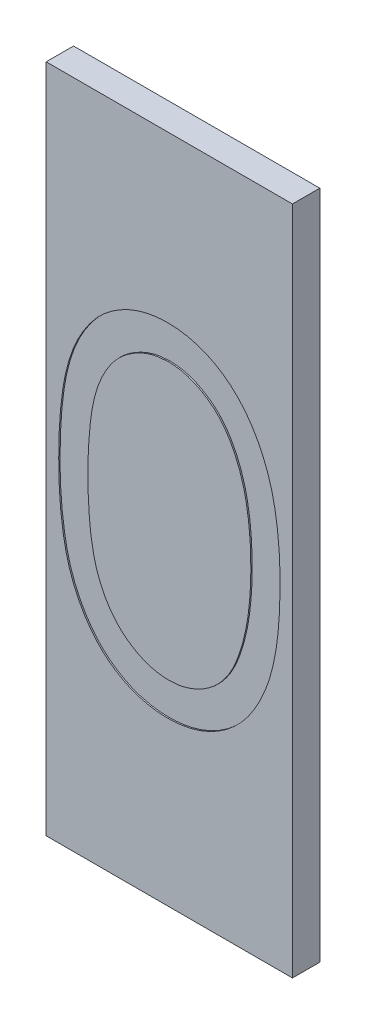
ISO-10303-21;
HEADER;
FILE_DESCRIPTION(('STEP AP214'),'2;1');
FILE_NAME('part.step','',(''),(''),'','','');
FILE_SCHEMA(('AUTOMOTIVE_DESIGN { 1 0 10303 214 1 1 1 1 }'));
ENDSEC;
DATA;
#1=APPLICATION_CONTEXT('core data for automotive mechanical design processes');
#2=APPLICATION_PROTOCOL_DEFINITION('international standard','automotive_design',2000,#1);
#3=PRODUCT_CONTEXT('',#1,'mechanical');
#4=PRODUCT('Part','Part','',(#3));
#5=PRODUCT_RELATED_PRODUCT_CATEGORY('part','',(#4));
#6=PRODUCT_DEFINITION_FORMATION('','',#4);
#7=PRODUCT_DEFINITION_CONTEXT('part definition',#1,'design');
#8=PRODUCT_DEFINITION('design','',#6,#7);
#9=PRODUCT_DEFINITION_SHAPE('','',#8);
#10=(LENGTH_UNIT() NAMED_UNIT(*) SI_UNIT(.MILLI.,.METRE.));
#11=(NAMED_UNIT(*) PLANE_ANGLE_UNIT() SI_UNIT($,.RADIAN.));
#12=(NAMED_UNIT(*) SI_UNIT($,.STERADIAN.) SOLID_ANGLE_UNIT());
#13=UNCERTAINTY_MEASURE_WITH_UNIT(LENGTH_MEASURE(1.E-05),#10,'distance_accuracy_value','');
#14=(GEOMETRIC_REPRESENTATION_CONTEXT(3) GLOBAL_UNCERTAINTY_ASSIGNED_CONTEXT((#13)) GLOBAL_UNIT_ASSIGNED_CONTEXT((#10,
#11,#12)) REPRESENTATION_CONTEXT('',''));
#15=CARTESIAN_POINT('',(0.,0.,0.));
#16=DIRECTION('',(0.,0.,1.));
#17=DIRECTION('',(1.,0.,0.));
#18=AXIS2_PLACEMENT_3D('',#15,#16,#17);
#19=CARTESIAN_POINT('',(0.,0.,2.));
#20=DIRECTION('',(0.,0.,1.));
#21=DIRECTION('',(1.,0.,0.));
#22=AXIS2_PLACEMENT_3D('',#19,#20,#21);
#23=PLANE('',#22);
#24=DIRECTION('',(0.,-1.,0.));
#25=VECTOR('',#24,1.);
#26=CARTESIAN_POINT('',(0.,0.,2.));
#27=LINE('',#26,#25);
#28=CARTESIAN_POINT('',(0.,49.,2.));
#29=VERTEX_POINT('',#28);
#30=CARTESIAN_POINT('',(0.,0.,2.));
#31=VERTEX_POINT('',#30);
#32=EDGE_CURVE('E240',#29,#31,#27,.T.);
#33=ORIENTED_EDGE('',*,*,#32,.T.);
#34=DIRECTION('',(1.,0.,0.));
#35=VECTOR('',#34,1.);
#36=CARTESIAN_POINT('',(18.,0.,2.));
#37=LINE('',#36,#35);
#38=CARTESIAN_POINT('',(18.,0.,2.));
#39=VERTEX_POINT('',#38);
#40=EDGE_CURVE('E243',#31,#39,#37,.T.);
#41=ORIENTED_EDGE('',*,*,#40,.T.);
#42=DIRECTION('',(0.,1.,0.));
#43=VECTOR('',#42,1.);
#44=CARTESIAN_POINT('',(18.,0.,2.));
#45=LINE('',#44,#43);
#46=CARTESIAN_POINT('',(18.,49.,2.));
#47=VERTEX_POINT('',#46);
#48=EDGE_CURVE('E246',#39,#47,#45,.T.);
#49=ORIENTED_EDGE('',*,*,#48,.T.);
#50=DIRECTION('',(-1.,0.,0.));
#51=VECTOR('',#50,1.);
#52=CARTESIAN_POINT('',(18.,49.,2.));
#53=LINE('',#52,#51);
#54=EDGE_CURVE('E248',#47,#29,#53,.T.);
#55=ORIENTED_EDGE('',*,*,#54,.T.);
#56=EDGE_LOOP('',(#33,#41,#49,#55));
#57=FACE_BOUND('',#56,.T.);
#58=CARTESIAN_POINT('',(17.0961538461538,24.3967097355769,2.));
#59=CARTESIAN_POINT('',(17.0917207441675,24.0325560047647,2.));
#60=CARTESIAN_POINT('',(17.0830830257339,23.323017310868,2.));
#61=CARTESIAN_POINT('',(17.0383243243322,22.2852619252102,2.));
#62=CARTESIAN_POINT('',(16.9501593514912,21.3055609520539,2.));
#63=CARTESIAN_POINT('',(16.8398735381761,20.3815647699687,2.));
#64=CARTESIAN_POINT('',(16.6871268079462,19.5171191846945,2.));
#65=CARTESIAN_POINT('',(16.499313087558,18.7092328477967,2.));
#66=CARTESIAN_POINT('',(16.2907814269314,17.9544169316444,2.));
#67=CARTESIAN_POINT('',(16.03336970272,17.2588550883696,2.));
#68=CARTESIAN_POINT('',(15.7516289769647,16.612844259593,2.));
#69=CARTESIAN_POINT('',(15.4450927315572,16.0095909825642,2.));
#70=CARTESIAN_POINT('',(15.1166855219386,15.4437631698688,2.));
#71=CARTESIAN_POINT('',(14.7588942389716,14.9198898916407,2.));
#72=CARTESIAN_POINT('',(14.3775308384745,14.43426009977,2.));
#73=CARTESIAN_POINT('',(13.9644330254364,13.9954459170872,2.));
#74=CARTESIAN_POINT('',(13.5312456517962,13.5928740239094,2.));
#75=CARTESIAN_POINT('',(13.0726004654973,13.2346549156401,2.));
#76=CARTESIAN_POINT('',(12.5935504472928,12.9211136555248,2.));
#77=CARTESIAN_POINT('',(12.1039717275003,12.6407122805649,2.));
#78=CARTESIAN_POINT('',(11.5951776372268,12.4146112660293,2.));
#79=CARTESIAN_POINT('',(11.0786984409778,12.2204710765199,2.));
#80=CARTESIAN_POINT('',(10.5471465215172,12.0721501449374,2.));
#81=CARTESIAN_POINT('',(10.0011844705765,11.969594092199,2.));
#82=CARTESIAN_POINT('',(9.44358936541881,11.8976677661049,2.));
#83=CARTESIAN_POINT('',(9.06666086013384,11.8921808226676,2.));
#84=CARTESIAN_POINT('',(8.87721604567308,11.8894230769231,2.));
#85=B_SPLINE_CURVE_WITH_KNOTS('',3,(#58,#59,#60,#61,#62,#63,#64,#65,#66,#67,#68,#69,#70,#71,#72,
#73,#74,#75,#76,#77,#78,#79,#80,#81,#82,#83,#84),.UNSPECIFIED.,.F.,.F.,(4,1,1,1,1,1,1,1,1,1,1,1,
1,1,1,1,1,1,1,1,1,1,1,1,4),(0.,0.0650632896172793,0.126773166466523,0.185515763226079,
0.240764679167715,0.292979796023598,0.342250372779767,0.38891928618566,0.43277566405831,
0.474628432631117,0.514774690637953,0.553605893498442,0.591426406431173,0.628028119946067,
0.66380363411032,0.698984336131664,0.733591489306705,0.767628469151139,0.801208347786592,
0.834263839726623,0.866980694728776,0.89971974151816,0.932701912498538,0.96617588343275,1.),.UNSPECIFIED.);
#86=CARTESIAN_POINT('',(17.0961538461538,24.3967097355769,2.));
#87=VERTEX_POINT('',#86);
#88=CARTESIAN_POINT('',(8.87721604567308,11.8894230769231,2.));
#89=VERTEX_POINT('',#88);
#90=EDGE_CURVE('E220',#87,#89,#85,.T.);
#91=ORIENTED_EDGE('',*,*,#90,.T.);
#92=CARTESIAN_POINT('',(8.87721604567308,11.8894230769231,2.));
#93=CARTESIAN_POINT('',(8.68940948445197,11.8925959595982,2.));
#94=CARTESIAN_POINT('',(8.31909160345805,11.8988522649224,2.));
#95=CARTESIAN_POINT('',(7.77036706609321,11.9635796166545,2.));
#96=CARTESIAN_POINT('',(7.23776687054643,12.0676436652957,2.));
#97=CARTESIAN_POINT('',(6.71866284754058,12.2133530609869,2.));
#98=CARTESIAN_POINT('',(6.21039173598908,12.3917075723473,2.));
#99=CARTESIAN_POINT('',(5.71987949999161,12.624074598289,2.));
#100=CARTESIAN_POINT('',(5.24167222345327,12.8916867460072,2.));
#101=CARTESIAN_POINT('',(4.77704574411597,13.1964555954356,2.));
#102=CARTESIAN_POINT('',(4.33473086275568,13.5456263324341,2.));
#103=CARTESIAN_POINT('',(3.91223856588833,13.9318262251047,2.));
#104=CARTESIAN_POINT('',(3.5201826323893,14.364692648396,2.));
#105=CARTESIAN_POINT('',(3.15527923184998,14.8373906609682,2.));
#106=CARTESIAN_POINT('',(2.80847338180396,15.3455714704106,2.));
#107=CARTESIAN_POINT('',(2.48945818118549,15.8961734370232,2.));
#108=CARTESIAN_POINT('',(2.19438147761533,16.4870133405329,2.));
#109=CARTESIAN_POINT('',(1.9246641571741,17.121908411376,2.));
#110=CARTESIAN_POINT('',(1.68552771433153,17.810123188422,2.));
#111=CARTESIAN_POINT('',(1.47429241448843,18.5595309921621,2.));
#112=CARTESIAN_POINT('',(1.30750859312958,19.3767463021523,2.));
#113=CARTESIAN_POINT('',(1.16474955773984,20.2552055319229,2.));
#114=CARTESIAN_POINT('',(1.04960330881889,21.1986835225837,2.));
#115=CARTESIAN_POINT('',(0.970992631206421,22.2076924777481,2.));
#116=CARTESIAN_POINT('',(0.922406184266691,23.281603631335,2.));
#117=CARTESIAN_POINT('',(0.918085437301245,24.0182247744533,2.));
#118=CARTESIAN_POINT('',(0.915865384615385,24.3967097355769,2.));
#119=B_SPLINE_CURVE_WITH_KNOTS('',3,(#92,#93,#94,#95,#96,#97,#98,#99,#100,#101,#102,#103,#104,
#105,#106,#107,#108,#109,#110,#111,#112,#113,#114,#115,#116,#117,#118),.UNSPECIFIED.,.F.,.F.,(4,
1,1,1,1,1,1,1,1,1,1,1,1,1,1,1,1,1,1,1,1,1,1,1,4),(0.,0.0337871463469911,0.0666216577242939,
0.0992848780959722,0.131361165042651,0.163585187595343,0.196103926987068,0.228902254323817,
0.262158055905007,0.295991222258316,0.3302178457248,0.365059825891954,0.400950737340107,
0.437620382076738,0.475707529437092,0.515380691625048,0.556413541493164,0.599764829872731,
0.646424155584087,0.696431444517566,0.749781517801557,0.806573306975532,0.867435531565399,
0.931886753250874,1.),.UNSPECIFIED.);
#120=CARTESIAN_POINT('',(0.915865384615385,24.3967097355769,2.));
#121=VERTEX_POINT('',#120);
#122=EDGE_CURVE('E47',#89,#121,#119,.T.);
#123=ORIENTED_EDGE('',*,*,#122,.T.);
#124=CARTESIAN_POINT('',(0.915865384615385,24.3967097355769,2.));
#125=CARTESIAN_POINT('',(0.918097079579565,24.7783723199832,2.));
#126=CARTESIAN_POINT('',(0.922432179214577,25.5197573913811,2.));
#127=CARTESIAN_POINT('',(0.970658757410889,26.6000600454427,2.));
#128=CARTESIAN_POINT('',(1.05077313993445,27.6135220116421,2.));
#129=CARTESIAN_POINT('',(1.16056490879078,28.5601918002249,2.));
#130=CARTESIAN_POINT('',(1.29417330995488,29.4403138052472,2.));
#131=CARTESIAN_POINT('',(1.47253224558167,30.2515359921924,2.));
#132=CARTESIAN_POINT('',(1.67536577765848,30.9976129586134,2.));
#133=CARTESIAN_POINT('',(1.91044581076208,31.680977609852,2.));
#134=CARTESIAN_POINT('',(2.17570201819045,32.3108366250564,2.));
#135=CARTESIAN_POINT('',(2.46440654203166,32.8988366552871,2.));
#136=CARTESIAN_POINT('',(2.78801701837777,33.4440880163846,2.));
#137=CARTESIAN_POINT('',(3.12803851525684,33.9552933404917,2.));
#138=CARTESIAN_POINT('',(3.49823493115321,34.4240845497038,2.));
#139=CARTESIAN_POINT('',(3.88807134486788,34.8570819500531,2.));
#140=CARTESIAN_POINT('',(4.31276303875672,35.2442783058872,2.));
#141=CARTESIAN_POINT('',(4.75787314861713,35.5970183274714,2.));
#142=CARTESIAN_POINT('',(5.22743159385364,35.9062370543823,2.));
#143=CARTESIAN_POINT('',(5.70805401886366,36.178602651036,2.));
#144=CARTESIAN_POINT('',(6.20304857834779,36.4112838907707,2.));
#145=CARTESIAN_POINT('',(6.71376671556408,36.5942348918866,2.));
#146=CARTESIAN_POINT('',(7.23561804692069,36.7453479743931,2.));
#147=CARTESIAN_POINT('',(7.77042683994536,36.8486870646314,2.));
#148=CARTESIAN_POINT('',(8.31907611958356,36.9137081741752,2.));
#149=CARTESIAN_POINT('',(8.68940427419239,36.9199243779076,2.));
#150=CARTESIAN_POINT('',(8.87721604567308,36.9230769230769,2.));
#151=B_SPLINE_CURVE_WITH_KNOTS('',3,(#124,#125,#126,#127,#128,#129,#130,#131,#132,#133,#134,
#135,#136,#137,#138,#139,#140,#141,#142,#143,#144,#145,#146,#147,#148,#149,#150),.UNSPECIFIED.,
.F.,.F.,(4,1,1,1,1,1,1,1,1,1,1,1,1,1,1,1,1,1,1,1,1,1,1,1,4),(0.,0.0685946222587426,
0.133246042443301,0.194312586468256,0.251279223116966,0.304513439256347,0.354234906653325,
0.400480588773989,0.443410754938492,0.484014868616345,0.523252300773203,0.56104237272836,
0.5979002393644,0.633518488856196,0.668314351169651,0.702495671286382,0.736685353513458,
0.770293169360789,0.803437255019249,0.835912951666029,0.868460245789291,0.900846538243183,
0.933466524630708,0.966257575298123,1.),.UNSPECIFIED.);
#152=CARTESIAN_POINT('',(8.87721604567308,36.9230769230769,2.));
#153=VERTEX_POINT('',#152);
#154=EDGE_CURVE('E204',#121,#153,#151,.T.);
#155=ORIENTED_EDGE('',*,*,#154,.T.);
#156=CARTESIAN_POINT('',(8.87721604567308,36.9230769230769,2.));
#157=CARTESIAN_POINT('',(9.06659671178975,36.9197580376853,2.));
#158=CARTESIAN_POINT('',(9.44321527231217,36.9131578188544,2.));
#159=CARTESIAN_POINT('',(10.0000221110389,36.8497217098244,2.));
#160=CARTESIAN_POINT('',(10.5439654812757,36.7444628187542,2.));
#161=CARTESIAN_POINT('',(11.0727263892404,36.5953219023971,2.));
#162=CARTESIAN_POINT('',(11.590648172173,36.4102941736964,2.));
#163=CARTESIAN_POINT('',(12.0936798027621,36.1783800376501,2.));
#164=CARTESIAN_POINT('',(12.5849458403625,35.9084220294672,2.));
#165=CARTESIAN_POINT('',(13.0566394036675,35.5912131499346,2.));
#166=CARTESIAN_POINT('',(13.5139388402185,35.2375480208102,2.));
#167=CARTESIAN_POINT('',(13.9456115882966,34.8377520062732,2.));
#168=CARTESIAN_POINT('',(14.3516969405632,34.3958619519632,2.));
#169=CARTESIAN_POINT('',(14.7372914289945,33.916605699449,2.));
#170=CARTESIAN_POINT('',(15.0914554027966,33.3907911044205,2.));
#171=CARTESIAN_POINT('',(15.4287317899698,32.8275635001493,2.));
#172=CARTESIAN_POINT('',(15.7306201056579,32.2170731521771,2.));
#173=CARTESIAN_POINT('',(16.0213685207122,31.5695060406157,2.));
#174=CARTESIAN_POINT('',(16.2723317697774,30.8669443619489,2.));
#175=CARTESIAN_POINT('',(16.498661045648,30.1133484019955,2.));
#176=CARTESIAN_POINT('',(16.6815340282739,29.2998168807255,2.));
#177=CARTESIAN_POINT('',(16.8338610418601,28.4306181404141,2.));
#178=CARTESIAN_POINT('',(16.9518682803472,27.502560084798,2.));
#179=CARTESIAN_POINT('',(17.0378153630602,26.5176321167626,2.));
#180=CARTESIAN_POINT('',(17.0832161737879,25.4751862447245,2.));
#181=CARTESIAN_POINT('',(17.0917662302119,24.7624587351442,2.));
#182=CARTESIAN_POINT('',(17.0961538461538,24.3967097355769,2.));
#183=B_SPLINE_CURVE_WITH_KNOTS('',3,(#156,#157,#158,#159,#160,#161,#162,#163,#164,#165,#166,
#167,#168,#169,#170,#171,#172,#173,#174,#175,#176,#177,#178,#179,#180,#181,#182),.UNSPECIFIED.,
.F.,.F.,(4,1,1,1,1,1,1,1,1,1,1,1,1,1,1,1,1,1,1,1,1,1,1,1,4),(0.,0.0337881161627104,
0.06719393237388,0.0998624108568251,0.132566612126258,0.165151173254786,0.197913187355792,
0.231319003566962,0.265083278267373,0.299255308758115,0.334398566504979,0.369942823509308,
0.406283560700061,0.444063819698508,0.482997706872775,0.523354446613304,0.565536589604149,
0.609612924065819,0.656390811376417,0.705885494936457,0.758324500261731,0.81383178294115,
0.87279455903939,0.934722229540074,1.),.UNSPECIFIED.);
#184=EDGE_CURVE('E212',#153,#87,#183,.T.);
#185=ORIENTED_EDGE('',*,*,#184,.T.);
#186=EDGE_LOOP('',(#91,#123,#155,#185));
#187=FACE_BOUND('',#186,.T.);
#188=ADVANCED_FACE('F32',(#57,#187),#23,.T.);
#189=CARTESIAN_POINT('',(0.,0.,2.));
#190=DIRECTION('',(1.,0.,0.));
#191=DIRECTION('',(0.,0.,-1.));
#192=AXIS2_PLACEMENT_3D('',#189,#190,#191);
#193=PLANE('',#192);
#194=DIRECTION('',(0.,-1.,0.));
#195=VECTOR('',#194,1.);
#196=CARTESIAN_POINT('',(0.,0.,0.));
#197=LINE('',#196,#195);
#198=CARTESIAN_POINT('',(0.,49.,0.));
#199=VERTEX_POINT('',#198);
#200=CARTESIAN_POINT('',(0.,0.,0.));
#201=VERTEX_POINT('',#200);
#202=EDGE_CURVE('E239',#199,#201,#197,.T.);
#203=ORIENTED_EDGE('',*,*,#202,.T.);
#204=DIRECTION('',(0.,0.,-1.));
#205=VECTOR('',#204,1.);
#206=CARTESIAN_POINT('',(0.,0.,2.));
#207=LINE('',#206,#205);
#208=EDGE_CURVE('E11',#31,#201,#207,.T.);
#209=ORIENTED_EDGE('',*,*,#208,.F.);
#210=ORIENTED_EDGE('',*,*,#32,.F.);
#211=DIRECTION('',(0.,0.,-1.));
#212=VECTOR('',#211,1.);
#213=CARTESIAN_POINT('',(0.,49.,2.));
#214=LINE('',#213,#212);
#215=EDGE_CURVE('E250',#29,#199,#214,.T.);
#216=ORIENTED_EDGE('',*,*,#215,.T.);
#217=EDGE_LOOP('',(#203,#209,#210,#216));
#218=FACE_BOUND('',#217,.T.);
#219=ADVANCED_FACE('F34',(#218),#193,.F.);
#220=CARTESIAN_POINT('',(18.,0.,2.));
#221=DIRECTION('',(0.,1.,0.));
#222=DIRECTION('',(0.,0.,1.));
#223=AXIS2_PLACEMENT_3D('',#220,#221,#222);
#224=PLANE('',#223);
#225=DIRECTION('',(1.,0.,0.));
#226=VECTOR('',#225,1.);
#227=CARTESIAN_POINT('',(18.,0.,0.));
#228=LINE('',#227,#226);
#229=CARTESIAN_POINT('',(18.,0.,0.));
#230=VERTEX_POINT('',#229);
#231=EDGE_CURVE('E253',#201,#230,#228,.T.);
#232=ORIENTED_EDGE('',*,*,#231,.T.);
#233=DIRECTION('',(0.,0.,-1.));
#234=VECTOR('',#233,1.);
#235=CARTESIAN_POINT('',(18.,0.,2.));
#236=LINE('',#235,#234);
#237=EDGE_CURVE('E40',#39,#230,#236,.T.);
#238=ORIENTED_EDGE('',*,*,#237,.F.);
#239=ORIENTED_EDGE('',*,*,#40,.F.);
#240=ORIENTED_EDGE('',*,*,#208,.T.);
#241=EDGE_LOOP('',(#232,#238,#239,#240));
#242=FACE_BOUND('',#241,.T.);
#243=ADVANCED_FACE('F283',(#242),#224,.F.);
#244=CARTESIAN_POINT('',(18.,0.,2.));
#245=DIRECTION('',(-1.,0.,0.));
#246=DIRECTION('',(0.,0.,1.));
#247=AXIS2_PLACEMENT_3D('',#244,#245,#246);
#248=PLANE('',#247);
#249=DIRECTION('',(0.,1.,0.));
#250=VECTOR('',#249,1.);
#251=CARTESIAN_POINT('',(18.,0.,0.));
#252=LINE('',#251,#250);
#253=CARTESIAN_POINT('',(18.,49.,0.));
#254=VERTEX_POINT('',#253);
#255=EDGE_CURVE('E255',#230,#254,#252,.T.);
#256=ORIENTED_EDGE('',*,*,#255,.T.);
#257=DIRECTION('',(0.,0.,-1.));
#258=VECTOR('',#257,1.);
#259=CARTESIAN_POINT('',(18.,49.,2.));
#260=LINE('',#259,#258);
#261=EDGE_CURVE('E260',#47,#254,#260,.T.);
#262=ORIENTED_EDGE('',*,*,#261,.F.);
#263=ORIENTED_EDGE('',*,*,#48,.F.);
#264=ORIENTED_EDGE('',*,*,#237,.T.);
#265=EDGE_LOOP('',(#256,#262,#263,#264));
#266=FACE_BOUND('',#265,.T.);
#267=ADVANCED_FACE('F267',(#266),#248,.F.);
#268=CARTESIAN_POINT('',(18.,49.,2.));
#269=DIRECTION('',(0.,-1.,0.));
#270=DIRECTION('',(0.,0.,-1.));
#271=AXIS2_PLACEMENT_3D('',#268,#269,#270);
#272=PLANE('',#271);
#273=DIRECTION('',(-1.,0.,0.));
#274=VECTOR('',#273,1.);
#275=CARTESIAN_POINT('',(18.,49.,0.));
#276=LINE('',#275,#274);
#277=EDGE_CURVE('E244',#254,#199,#276,.T.);
#278=ORIENTED_EDGE('',*,*,#277,.T.);
#279=ORIENTED_EDGE('',*,*,#215,.F.);
#280=ORIENTED_EDGE('',*,*,#54,.F.);
#281=ORIENTED_EDGE('',*,*,#261,.T.);
#282=EDGE_LOOP('',(#278,#279,#280,#281));
#283=FACE_BOUND('',#282,.T.);
#284=ADVANCED_FACE('F276',(#283),#272,.F.);
#285=CARTESIAN_POINT('',(0.,0.,0.));
#286=DIRECTION('',(0.,0.,1.));
#287=DIRECTION('',(1.,0.,0.));
#288=AXIS2_PLACEMENT_3D('',#285,#286,#287);
#289=PLANE('',#288);
#290=ORIENTED_EDGE('',*,*,#202,.F.);
#291=ORIENTED_EDGE('',*,*,#277,.F.);
#292=ORIENTED_EDGE('',*,*,#255,.F.);
#293=ORIENTED_EDGE('',*,*,#231,.F.);
#294=EDGE_LOOP('',(#290,#291,#292,#293));
#295=FACE_BOUND('',#294,.T.);
#296=ADVANCED_FACE('F273',(#295),#289,.F.);
#297=CARTESIAN_POINT('',(8.87721604567308,11.8894230769231,1.9));
#298=CARTESIAN_POINT('',(8.68940948445197,11.8925959595982,1.9));
#299=CARTESIAN_POINT('',(8.31909160345805,11.8988522649224,1.9));
#300=CARTESIAN_POINT('',(7.77036706609321,11.9635796166545,1.9));
#301=CARTESIAN_POINT('',(7.23776687054643,12.0676436652957,1.9));
#302=CARTESIAN_POINT('',(6.71866284754058,12.2133530609869,1.9));
#303=CARTESIAN_POINT('',(6.21039173598908,12.3917075723473,1.9));
#304=CARTESIAN_POINT('',(5.71987949999161,12.624074598289,1.9));
#305=CARTESIAN_POINT('',(5.24167222345327,12.8916867460072,1.9));
#306=CARTESIAN_POINT('',(4.77704574411597,13.1964555954356,1.9));
#307=CARTESIAN_POINT('',(4.33473086275568,13.5456263324341,1.9));
#308=CARTESIAN_POINT('',(3.91223856588833,13.9318262251047,1.9));
#309=CARTESIAN_POINT('',(3.5201826323893,14.364692648396,1.9));
#310=CARTESIAN_POINT('',(3.15527923184998,14.8373906609682,1.9));
#311=CARTESIAN_POINT('',(2.80847338180396,15.3455714704106,1.9));
#312=CARTESIAN_POINT('',(2.48945818118549,15.8961734370232,1.9));
#313=CARTESIAN_POINT('',(2.19438147761533,16.4870133405329,1.9));
#314=CARTESIAN_POINT('',(1.9246641571741,17.121908411376,1.9));
#315=CARTESIAN_POINT('',(1.68552771433153,17.810123188422,1.9));
#316=CARTESIAN_POINT('',(1.47429241448843,18.5595309921621,1.9));
#317=CARTESIAN_POINT('',(1.30750859312958,19.3767463021523,1.9));
#318=CARTESIAN_POINT('',(1.16474955773984,20.2552055319229,1.9));
#319=CARTESIAN_POINT('',(1.04960330881889,21.1986835225837,1.9));
#320=CARTESIAN_POINT('',(0.970992631206421,22.2076924777481,1.9));
#321=CARTESIAN_POINT('',(0.922406184266691,23.281603631335,1.9));
#322=CARTESIAN_POINT('',(0.918085437301245,24.0182247744533,1.9));
#323=CARTESIAN_POINT('',(0.915865384615385,24.3967097355769,1.9));
#324=B_SPLINE_CURVE_WITH_KNOTS('',3,(#297,#298,#299,#300,#301,#302,#303,#304,#305,#306,#307,
#308,#309,#310,#311,#312,#313,#314,#315,#316,#317,#318,#319,#320,#321,#322,#323),.UNSPECIFIED.,
.F.,.F.,(4,1,1,1,1,1,1,1,1,1,1,1,1,1,1,1,1,1,1,1,1,1,1,1,4),(0.,0.0337871463469911,
0.0666216577242939,0.0992848780959722,0.131361165042651,0.163585187595343,0.196103926987068,
0.228902254323817,0.262158055905007,0.295991222258316,0.3302178457248,0.365059825891954,
0.400950737340107,0.437620382076738,0.475707529437092,0.515380691625048,0.556413541493164,
0.599764829872731,0.646424155584087,0.696431444517566,0.749781517801557,0.806573306975532,
0.867435531565399,0.931886753250874,1.),.UNSPECIFIED.);
#325=DIRECTION('',(0.,0.,1.));
#326=VECTOR('',#325,1.);
#327=SURFACE_OF_LINEAR_EXTRUSION('',#324,#326);
#328=ORIENTED_EDGE('',*,*,#122,.F.);
#329=DIRECTION('',(0.,0.,1.));
#330=VECTOR('',#329,1.);
#331=CARTESIAN_POINT('',(8.87721604567308,11.8894230769231,1.9));
#332=LINE('',#331,#330);
#333=CARTESIAN_POINT('',(8.87721604567308,11.8894230769231,1.9));
#334=VERTEX_POINT('',#333);
#335=EDGE_CURVE('E192',#334,#89,#332,.T.);
#336=ORIENTED_EDGE('',*,*,#335,.F.);
#337=CARTESIAN_POINT('',(0.915865384615385,24.3967097355769,1.9));
#338=VERTEX_POINT('',#337);
#339=EDGE_CURVE('E228',#334,#338,#324,.T.);
#340=ORIENTED_EDGE('',*,*,#339,.T.);
#341=DIRECTION('',(0.,0.,1.));
#342=VECTOR('',#341,1.);
#343=CARTESIAN_POINT('',(0.915865384615385,24.3967097355769,1.9));
#344=LINE('',#343,#342);
#345=EDGE_CURVE('E237',#338,#121,#344,.T.);
#346=ORIENTED_EDGE('',*,*,#345,.T.);
#347=EDGE_LOOP('',(#328,#336,#340,#346));
#348=FACE_BOUND('',#347,.T.);
#349=ADVANCED_FACE('F360',(#348),#327,.T.);
#350=CARTESIAN_POINT('',(0.915865384615385,24.3967097355769,1.9));
#351=CARTESIAN_POINT('',(0.918097079579565,24.7783723199832,1.9));
#352=CARTESIAN_POINT('',(0.922432179214577,25.5197573913811,1.9));
#353=CARTESIAN_POINT('',(0.970658757410889,26.6000600454427,1.9));
#354=CARTESIAN_POINT('',(1.05077313993445,27.6135220116421,1.9));
#355=CARTESIAN_POINT('',(1.16056490879078,28.5601918002249,1.9));
#356=CARTESIAN_POINT('',(1.29417330995488,29.4403138052472,1.9));
#357=CARTESIAN_POINT('',(1.47253224558167,30.2515359921924,1.9));
#358=CARTESIAN_POINT('',(1.67536577765848,30.9976129586134,1.9));
#359=CARTESIAN_POINT('',(1.91044581076208,31.680977609852,1.9));
#360=CARTESIAN_POINT('',(2.17570201819045,32.3108366250564,1.9));
#361=CARTESIAN_POINT('',(2.46440654203166,32.8988366552871,1.9));
#362=CARTESIAN_POINT('',(2.78801701837777,33.4440880163846,1.9));
#363=CARTESIAN_POINT('',(3.12803851525684,33.9552933404917,1.9));
#364=CARTESIAN_POINT('',(3.49823493115321,34.4240845497038,1.9));
#365=CARTESIAN_POINT('',(3.88807134486788,34.8570819500531,1.9));
#366=CARTESIAN_POINT('',(4.31276303875672,35.2442783058872,1.9));
#367=CARTESIAN_POINT('',(4.75787314861713,35.5970183274714,1.9));
#368=CARTESIAN_POINT('',(5.22743159385364,35.9062370543823,1.9));
#369=CARTESIAN_POINT('',(5.70805401886366,36.178602651036,1.9));
#370=CARTESIAN_POINT('',(6.20304857834779,36.4112838907707,1.9));
#371=CARTESIAN_POINT('',(6.71376671556408,36.5942348918866,1.9));
#372=CARTESIAN_POINT('',(7.23561804692069,36.7453479743931,1.9));
#373=CARTESIAN_POINT('',(7.77042683994536,36.8486870646314,1.9));
#374=CARTESIAN_POINT('',(8.31907611958356,36.9137081741752,1.9));
#375=CARTESIAN_POINT('',(8.68940427419239,36.9199243779076,1.9));
#376=CARTESIAN_POINT('',(8.87721604567308,36.9230769230769,1.9));
#377=B_SPLINE_CURVE_WITH_KNOTS('',3,(#350,#351,#352,#353,#354,#355,#356,#357,#358,#359,#360,
#361,#362,#363,#364,#365,#366,#367,#368,#369,#370,#371,#372,#373,#374,#375,#376),.UNSPECIFIED.,
.F.,.F.,(4,1,1,1,1,1,1,1,1,1,1,1,1,1,1,1,1,1,1,1,1,1,1,1,4),(0.,0.0685946222587426,
0.133246042443301,0.194312586468256,0.251279223116966,0.304513439256347,0.354234906653325,
0.400480588773989,0.443410754938492,0.484014868616345,0.523252300773203,0.56104237272836,
0.5979002393644,0.633518488856196,0.668314351169651,0.702495671286382,0.736685353513458,
0.770293169360789,0.803437255019249,0.835912951666029,0.868460245789291,0.900846538243183,
0.933466524630708,0.966257575298123,1.),.UNSPECIFIED.);
#378=DIRECTION('',(0.,0.,1.));
#379=VECTOR('',#378,1.);
#380=SURFACE_OF_LINEAR_EXTRUSION('',#377,#379);
#381=ORIENTED_EDGE('',*,*,#154,.F.);
#382=ORIENTED_EDGE('',*,*,#345,.F.);
#383=CARTESIAN_POINT('',(8.87721604567308,36.9230769230769,1.9));
#384=VERTEX_POINT('',#383);
#385=EDGE_CURVE('E353',#338,#384,#377,.T.);
#386=ORIENTED_EDGE('',*,*,#385,.T.);
#387=DIRECTION('',(0.,0.,1.));
#388=VECTOR('',#387,1.);
#389=CARTESIAN_POINT('',(8.87721604567308,36.9230769230769,1.9));
#390=LINE('',#389,#388);
#391=EDGE_CURVE('E235',#384,#153,#390,.T.);
#392=ORIENTED_EDGE('',*,*,#391,.T.);
#393=EDGE_LOOP('',(#381,#382,#386,#392));
#394=FACE_BOUND('',#393,.T.);
#395=ADVANCED_FACE('F362',(#394),#380,.T.);
#396=CARTESIAN_POINT('',(8.87721604567308,36.9230769230769,1.9));
#397=CARTESIAN_POINT('',(9.06659671178975,36.9197580376853,1.9));
#398=CARTESIAN_POINT('',(9.44321527231217,36.9131578188544,1.9));
#399=CARTESIAN_POINT('',(10.0000221110389,36.8497217098244,1.9));
#400=CARTESIAN_POINT('',(10.5439654812757,36.7444628187542,1.9));
#401=CARTESIAN_POINT('',(11.0727263892404,36.5953219023971,1.9));
#402=CARTESIAN_POINT('',(11.590648172173,36.4102941736964,1.9));
#403=CARTESIAN_POINT('',(12.0936798027621,36.1783800376501,1.9));
#404=CARTESIAN_POINT('',(12.5849458403625,35.9084220294672,1.9));
#405=CARTESIAN_POINT('',(13.0566394036675,35.5912131499346,1.9));
#406=CARTESIAN_POINT('',(13.5139388402185,35.2375480208102,1.9));
#407=CARTESIAN_POINT('',(13.9456115882966,34.8377520062732,1.9));
#408=CARTESIAN_POINT('',(14.3516969405632,34.3958619519632,1.9));
#409=CARTESIAN_POINT('',(14.7372914289945,33.916605699449,1.9));
#410=CARTESIAN_POINT('',(15.0914554027966,33.3907911044205,1.9));
#411=CARTESIAN_POINT('',(15.4287317899698,32.8275635001493,1.9));
#412=CARTESIAN_POINT('',(15.7306201056579,32.2170731521771,1.9));
#413=CARTESIAN_POINT('',(16.0213685207122,31.5695060406157,1.9));
#414=CARTESIAN_POINT('',(16.2723317697774,30.8669443619489,1.9));
#415=CARTESIAN_POINT('',(16.498661045648,30.1133484019955,1.9));
#416=CARTESIAN_POINT('',(16.6815340282739,29.2998168807255,1.9));
#417=CARTESIAN_POINT('',(16.8338610418601,28.4306181404141,1.9));
#418=CARTESIAN_POINT('',(16.9518682803472,27.502560084798,1.9));
#419=CARTESIAN_POINT('',(17.0378153630602,26.5176321167626,1.9));
#420=CARTESIAN_POINT('',(17.0832161737879,25.4751862447245,1.9));
#421=CARTESIAN_POINT('',(17.0917662302119,24.7624587351442,1.9));
#422=CARTESIAN_POINT('',(17.0961538461538,24.3967097355769,1.9));
#423=B_SPLINE_CURVE_WITH_KNOTS('',3,(#396,#397,#398,#399,#400,#401,#402,#403,#404,#405,#406,
#407,#408,#409,#410,#411,#412,#413,#414,#415,#416,#417,#418,#419,#420,#421,#422),.UNSPECIFIED.,
.F.,.F.,(4,1,1,1,1,1,1,1,1,1,1,1,1,1,1,1,1,1,1,1,1,1,1,1,4),(0.,0.0337881161627104,
0.06719393237388,0.0998624108568251,0.132566612126258,0.165151173254786,0.197913187355792,
0.231319003566962,0.265083278267373,0.299255308758115,0.334398566504979,0.369942823509308,
0.406283560700061,0.444063819698508,0.482997706872775,0.523354446613304,0.565536589604149,
0.609612924065819,0.656390811376417,0.705885494936457,0.758324500261731,0.81383178294115,
0.87279455903939,0.934722229540074,1.),.UNSPECIFIED.);
#424=DIRECTION('',(0.,0.,1.));
#425=VECTOR('',#424,1.);
#426=SURFACE_OF_LINEAR_EXTRUSION('',#423,#425);
#427=ORIENTED_EDGE('',*,*,#184,.F.);
#428=ORIENTED_EDGE('',*,*,#391,.F.);
#429=CARTESIAN_POINT('',(17.0961538461538,24.3967097355769,1.9));
#430=VERTEX_POINT('',#429);
#431=EDGE_CURVE('E193',#384,#430,#423,.T.);
#432=ORIENTED_EDGE('',*,*,#431,.T.);
#433=DIRECTION('',(0.,0.,1.));
#434=VECTOR('',#433,1.);
#435=CARTESIAN_POINT('',(17.0961538461538,24.3967097355769,1.9));
#436=LINE('',#435,#434);
#437=EDGE_CURVE('E233',#430,#87,#436,.T.);
#438=ORIENTED_EDGE('',*,*,#437,.T.);
#439=EDGE_LOOP('',(#427,#428,#432,#438));
#440=FACE_BOUND('',#439,.T.);
#441=ADVANCED_FACE('F183',(#440),#426,.T.);
#442=CARTESIAN_POINT('',(17.0961538461538,24.3967097355769,1.9));
#443=CARTESIAN_POINT('',(17.0917207441675,24.0325560047647,1.9));
#444=CARTESIAN_POINT('',(17.0830830257339,23.323017310868,1.9));
#445=CARTESIAN_POINT('',(17.0383243243322,22.2852619252102,1.9));
#446=CARTESIAN_POINT('',(16.9501593514912,21.3055609520539,1.9));
#447=CARTESIAN_POINT('',(16.8398735381761,20.3815647699687,1.9));
#448=CARTESIAN_POINT('',(16.6871268079462,19.5171191846945,1.9));
#449=CARTESIAN_POINT('',(16.499313087558,18.7092328477967,1.9));
#450=CARTESIAN_POINT('',(16.2907814269314,17.9544169316444,1.9));
#451=CARTESIAN_POINT('',(16.03336970272,17.2588550883696,1.9));
#452=CARTESIAN_POINT('',(15.7516289769647,16.612844259593,1.9));
#453=CARTESIAN_POINT('',(15.4450927315572,16.0095909825642,1.9));
#454=CARTESIAN_POINT('',(15.1166855219386,15.4437631698688,1.9));
#455=CARTESIAN_POINT('',(14.7588942389716,14.9198898916407,1.9));
#456=CARTESIAN_POINT('',(14.3775308384745,14.43426009977,1.9));
#457=CARTESIAN_POINT('',(13.9644330254364,13.9954459170872,1.9));
#458=CARTESIAN_POINT('',(13.5312456517962,13.5928740239094,1.9));
#459=CARTESIAN_POINT('',(13.0726004654973,13.2346549156401,1.9));
#460=CARTESIAN_POINT('',(12.5935504472928,12.9211136555248,1.9));
#461=CARTESIAN_POINT('',(12.1039717275003,12.6407122805649,1.9));
#462=CARTESIAN_POINT('',(11.5951776372268,12.4146112660293,1.9));
#463=CARTESIAN_POINT('',(11.0786984409778,12.2204710765199,1.9));
#464=CARTESIAN_POINT('',(10.5471465215172,12.0721501449374,1.9));
#465=CARTESIAN_POINT('',(10.0011844705765,11.969594092199,1.9));
#466=CARTESIAN_POINT('',(9.44358936541881,11.8976677661049,1.9));
#467=CARTESIAN_POINT('',(9.06666086013384,11.8921808226676,1.9));
#468=CARTESIAN_POINT('',(8.87721604567308,11.8894230769231,1.9));
#469=B_SPLINE_CURVE_WITH_KNOTS('',3,(#442,#443,#444,#445,#446,#447,#448,#449,#450,#451,#452,
#453,#454,#455,#456,#457,#458,#459,#460,#461,#462,#463,#464,#465,#466,#467,#468),.UNSPECIFIED.,
.F.,.F.,(4,1,1,1,1,1,1,1,1,1,1,1,1,1,1,1,1,1,1,1,1,1,1,1,4),(0.,0.0650632896172793,
0.126773166466523,0.185515763226079,0.240764679167715,0.292979796023598,0.342250372779767,
0.38891928618566,0.43277566405831,0.474628432631117,0.514774690637953,0.553605893498442,
0.591426406431173,0.628028119946067,0.66380363411032,0.698984336131664,0.733591489306705,
0.767628469151139,0.801208347786592,0.834263839726623,0.866980694728776,0.89971974151816,
0.932701912498538,0.96617588343275,1.),.UNSPECIFIED.);
#470=DIRECTION('',(0.,0.,1.));
#471=VECTOR('',#470,1.);
#472=SURFACE_OF_LINEAR_EXTRUSION('',#469,#471);
#473=ORIENTED_EDGE('',*,*,#90,.F.);
#474=ORIENTED_EDGE('',*,*,#437,.F.);
#475=EDGE_CURVE('E187',#430,#334,#469,.T.);
#476=ORIENTED_EDGE('',*,*,#475,.T.);
#477=ORIENTED_EDGE('',*,*,#335,.T.);
#478=EDGE_LOOP('',(#473,#474,#476,#477));
#479=FACE_BOUND('',#478,.T.);
#480=ADVANCED_FACE('F179',(#479),#472,.T.);
#481=CARTESIAN_POINT('',(2.31411923552324,16.2515905762188,1.9));
#482=DIRECTION('',(0.,0.,1.));
#483=DIRECTION('',(0.,-1.,0.));
#484=AXIS2_PLACEMENT_3D('',#481,#482,#483);
#485=PLANE('',#484);
#486=CARTESIAN_POINT('',(14.9591346153846,24.40625,1.9));
#487=CARTESIAN_POINT('',(14.9553913636391,24.6924597344531,1.9));
#488=CARTESIAN_POINT('',(14.9480687630166,25.252347159121,1.9));
#489=CARTESIAN_POINT('',(14.9200789538357,26.0723012096972,1.9));
#490=CARTESIAN_POINT('',(14.8478007059526,26.8510907973113,1.9));
#491=CARTESIAN_POINT('',(14.7675245579638,27.5920709774024,1.9));
#492=CARTESIAN_POINT('',(14.6491613216051,28.2911400011597,1.9));
#493=CARTESIAN_POINT('',(14.5215412426516,28.9541501137072,1.9));
#494=CARTESIAN_POINT('',(14.3500829947485,29.572887478996,1.9));
#495=CARTESIAN_POINT('',(14.1669323828719,30.1570392759982,1.9));
#496=CARTESIAN_POINT('',(13.9573116561313,30.6999687289411,1.9));
#497=CARTESIAN_POINT('',(13.7265635355575,31.2042071682965,1.9));
#498=CARTESIAN_POINT('',(13.4801262125039,31.6721889563741,1.9));
#499=CARTESIAN_POINT('',(13.2124584693793,32.1026301124571,1.9));
#500=CARTESIAN_POINT('',(12.9267378399531,32.4974586633347,1.9));
#501=CARTESIAN_POINT('',(12.615423085591,32.8487583155891,1.9));
#502=CARTESIAN_POINT('',(12.2908629777172,33.1674169736133,1.9));
#503=CARTESIAN_POINT('',(11.8362674813099,33.531153381387,1.9));
#504=CARTESIAN_POINT('',(11.2411299024894,33.9020275952992,1.9));
#505=CARTESIAN_POINT('',(10.500590766106,34.2433339257776,1.9));
#506=CARTESIAN_POINT('',(9.72994584718308,34.4393332023591,1.9));
#507=CARTESIAN_POINT('',(9.20897288273551,34.4669671802436,1.9));
#508=CARTESIAN_POINT('',(8.94876802884616,34.4807692307692,1.9));
#509=B_SPLINE_CURVE_WITH_KNOTS('',3,(#486,#487,#488,#489,#490,#491,#492,#493,#494,#495,#496,
#497,#498,#499,#500,#501,#502,#503,#504,#505,#506,#507,#508),.UNSPECIFIED.,.F.,.F.,(4,1,1,1,1,1,
1,1,1,1,1,1,1,1,1,1,1,1,1,1,4),(0.,0.0656811979906388,0.128486464174065,0.188175130328008,
0.245106130669986,0.299448424529475,0.350822936009382,0.399941680533777,0.446671743632372,
0.491254533373498,0.533376344270436,0.573852754968223,0.612526311719453,0.649597136445329,
0.68553204155385,0.7201057860682,0.75383766297365,0.818925416046714,0.880493461650164,
0.940311333846057,1.),.UNSPECIFIED.);
#510=CARTESIAN_POINT('',(14.9591346153846,24.40625,1.9));
#511=VERTEX_POINT('',#510);
#512=CARTESIAN_POINT('',(8.94876802884616,34.4807692307692,1.9));
#513=VERTEX_POINT('',#512);
#514=EDGE_CURVE('E141',#511,#513,#509,.T.);
#515=ORIENTED_EDGE('',*,*,#514,.F.);
#516=CARTESIAN_POINT('',(14.0575796274038,18.4197340745192,1.9));
#517=CARTESIAN_POINT('',(14.1293693332864,18.6322078376741,1.9));
#518=CARTESIAN_POINT('',(14.2751332238251,19.0636206979734,1.9));
#519=CARTESIAN_POINT('',(14.4629919023457,19.7328448308781,1.9));
#520=CARTESIAN_POINT('',(14.6109382790709,20.4349922069559,1.9));
#521=CARTESIAN_POINT('',(14.7440390353304,21.1658666617724,1.9));
#522=CARTESIAN_POINT('',(14.8348875049177,21.9308581990078,1.9));
#523=CARTESIAN_POINT('',(14.9080110202912,22.7275998467203,1.9));
#524=CARTESIAN_POINT('',(14.9510823010744,23.5566923290722,1.9));
#525=CARTESIAN_POINT('',(14.9564214110418,24.119993965597,1.9));
#526=CARTESIAN_POINT('',(14.9591346153846,24.40625,1.9));
#527=B_SPLINE_CURVE_WITH_KNOTS('',3,(#516,#517,#518,#519,#520,#521,#522,#523,#524,#525,#526),
.UNSPECIFIED.,.F.,.F.,(4,1,1,1,1,1,1,1,4),(0.,0.110588338595336,0.224541754053596,
0.342503494050104,0.464324098417358,0.590756032701767,0.722227475355514,0.858842836208724,1.),.UNSPECIFIED.);
#528=CARTESIAN_POINT('',(14.0575796274038,18.4197340745192,1.9));
#529=VERTEX_POINT('',#528);
#530=EDGE_CURVE('E484',#529,#511,#527,.T.);
#531=ORIENTED_EDGE('',*,*,#530,.F.);
#532=CARTESIAN_POINT('',(8.94876802884615,14.3317307692308,1.9));
#533=CARTESIAN_POINT('',(9.21245861636114,14.3426013851093,1.9));
#534=CARTESIAN_POINT('',(9.73929536874279,14.3643201731019,1.9));
#535=CARTESIAN_POINT('',(10.5090092249927,14.5738615827372,1.9));
#536=CARTESIAN_POINT('',(11.2562473125166,14.8900204137312,1.9));
#537=CARTESIAN_POINT('',(11.8418439061998,15.2638596916729,1.9));
#538=CARTESIAN_POINT('',(12.2873590682363,15.6198792188325,1.9));
#539=CARTESIAN_POINT('',(12.6065621616355,15.92341816539,1.9));
#540=CARTESIAN_POINT('',(12.8995378840117,16.2632964768854,1.9));
#541=CARTESIAN_POINT('',(13.1774098575761,16.6300041865922,1.9));
#542=CARTESIAN_POINT('',(13.4322653545785,17.030547337846,1.9));
#543=CARTESIAN_POINT('',(13.6640163449691,17.4629998588523,1.9));
#544=CARTESIAN_POINT('',(13.8754941202317,17.9285626585763,1.9));
#545=CARTESIAN_POINT('',(13.9959788792861,18.2535674907751,1.9));
#546=CARTESIAN_POINT('',(14.0575796274038,18.4197340745192,1.9));
#547=B_SPLINE_CURVE_WITH_KNOTS('',3,(#532,#533,#534,#535,#536,#537,#538,#539,#540,#541,#542,
#543,#544,#545,#546),.UNSPECIFIED.,.F.,.F.,(4,1,1,1,1,1,1,1,1,1,1,1,4),(0.,0.112813400744458,
0.225393883920729,0.339594814562701,0.459675410224864,0.521735190087933,0.583925838738916,
0.648174144765369,0.713881038113066,0.781004454907389,0.851450927556555,0.924050692664178,1.),.UNSPECIFIED.);
#548=CARTESIAN_POINT('',(8.94876802884615,14.3317307692308,1.9));
#549=VERTEX_POINT('',#548);
#550=EDGE_CURVE('E152',#549,#529,#547,.T.);
#551=ORIENTED_EDGE('',*,*,#550,.F.);
#552=CARTESIAN_POINT('',(3.05288461538462,24.40625,1.9));
#553=CARTESIAN_POINT('',(3.05369728204039,24.0881918884952,1.9));
#554=CARTESIAN_POINT('',(3.05527450844394,23.4709035479867,1.9));
#555=CARTESIAN_POINT('',(3.09647830165682,22.5738985045611,1.9));
#556=CARTESIAN_POINT('',(3.15260934436753,21.7372610888586,1.9));
#557=CARTESIAN_POINT('',(3.22500816985933,20.9599289925512,1.9));
#558=CARTESIAN_POINT('',(3.33252465893816,20.2445333717255,1.9));
#559=CARTESIAN_POINT('',(3.45299405462632,19.5861539208717,1.9));
#560=CARTESIAN_POINT('',(3.59959802149993,18.9882748612224,1.9));
#561=CARTESIAN_POINT('',(3.7730551966308,18.4467935062505,1.9));
#562=CARTESIAN_POINT('',(3.97062476656666,17.9525203795232,1.9));
#563=CARTESIAN_POINT('',(4.1863378747505,17.4925906837461,1.9));
#564=CARTESIAN_POINT('',(4.41807243594286,17.061571259067,1.9));
#565=CARTESIAN_POINT('',(4.67741879952652,16.6633336735216,1.9));
#566=CARTESIAN_POINT('',(4.95986949756668,16.2965792358116,1.9));
#567=CARTESIAN_POINT('',(5.25904470705575,15.9548165730474,1.9));
#568=CARTESIAN_POINT('',(5.58610996770299,15.6500371107463,1.9));
#569=CARTESIAN_POINT('',(6.03857293036304,15.2845026149208,1.9));
#570=CARTESIAN_POINT('',(6.63590251530421,14.9067742229391,1.9));
#571=CARTESIAN_POINT('',(7.38851668393012,14.5778481474774,1.9));
#572=CARTESIAN_POINT('',(8.16186810935784,14.3711389349647,1.9));
#573=CARTESIAN_POINT('',(8.68677215012785,14.3448515953415,1.9));
#574=CARTESIAN_POINT('',(8.94876802884615,14.3317307692308,1.9));
#575=B_SPLINE_CURVE_WITH_KNOTS('',3,(#552,#553,#554,#555,#556,#557,#558,#559,#560,#561,#562,
#563,#564,#565,#566,#567,#568,#569,#570,#571,#572,#573,#574),.UNSPECIFIED.,.F.,.F.,(4,1,1,1,1,1,
1,1,1,1,1,1,1,1,1,1,1,1,1,1,4),(0.,0.0729510658758665,0.141583694186545,0.205926460170867,
0.265301357184606,0.320597232713928,0.37181650309881,0.418789769709452,0.461698728615765,
0.502133582103566,0.540804315292648,0.578180525327966,0.614296865207515,0.649678243264788,
0.684299460089638,0.718358952772361,0.752080864647597,0.817652438602386,0.879722076405437,
0.939965559730987,1.),.UNSPECIFIED.);
#576=CARTESIAN_POINT('',(3.05288461538462,24.40625,1.9));
#577=VERTEX_POINT('',#576);
#578=EDGE_CURVE('E133',#577,#549,#575,.T.);
#579=ORIENTED_EDGE('',*,*,#578,.F.);
#580=CARTESIAN_POINT('',(8.94876802884615,34.4807692307692,1.9));
#581=CARTESIAN_POINT('',(8.68539775054128,34.4669481384013,1.9));
#582=CARTESIAN_POINT('',(8.1581773963351,34.4392807749439,1.9));
#583=CARTESIAN_POINT('',(7.37952256149766,34.2440641746154,1.9));
#584=CARTESIAN_POINT('',(6.63314116907419,33.9037973885042,1.9));
#585=CARTESIAN_POINT('',(6.03957735920555,33.5299249972696,1.9));
#586=CARTESIAN_POINT('',(5.58466481171638,33.1738375569255,1.9));
#587=CARTESIAN_POINT('',(5.26433434427811,32.8650475748492,1.9));
#588=CARTESIAN_POINT('',(4.963982708297,32.527275737115,1.9));
#589=CARTESIAN_POINT('',(4.68729710557478,32.1571484235795,1.9));
#590=CARTESIAN_POINT('',(4.42815394671314,31.7593751209262,1.9));
#591=CARTESIAN_POINT('',(4.19015812901058,31.3308265609204,1.9));
#592=CARTESIAN_POINT('',(3.97572772532176,30.8693310293155,1.9));
#593=CARTESIAN_POINT('',(3.77784900595311,30.3752799240536,1.9));
#594=CARTESIAN_POINT('',(3.603862715989,29.8338452842332,1.9));
#595=CARTESIAN_POINT('',(3.46034843044212,29.2367026671063,1.9));
#596=CARTESIAN_POINT('',(3.32776687260855,28.5804172961834,1.9));
#597=CARTESIAN_POINT('',(3.23390977526724,27.8611470724849,1.9));
#598=CARTESIAN_POINT('',(3.15047243695988,27.0836202790264,1.9));
#599=CARTESIAN_POINT('',(3.09685112321328,26.2448942389303,1.9));
#600=CARTESIAN_POINT('',(3.0551366750744,25.3463847936929,1.9));
#601=CARTESIAN_POINT('',(3.05365033717781,24.7259048045945,1.9));
#602=CARTESIAN_POINT('',(3.05288461538462,24.40625,1.9));
#603=B_SPLINE_CURVE_WITH_KNOTS('',3,(#580,#581,#582,#583,#584,#585,#586,#587,#588,#589,#590,
#591,#592,#593,#594,#595,#596,#597,#598,#599,#600,#601,#602),.UNSPECIFIED.,.F.,.F.,(4,1,1,1,1,1,
1,1,1,1,1,1,1,1,1,1,1,1,1,1,4),(0.,0.0603866193110622,0.120883248585996,0.18275461862514,
0.247811029758351,0.281299100043249,0.315087624150657,0.349702395550275,0.384856581118555,
0.420966197226102,0.458511188261139,0.497174722127312,0.537602047866269,0.580503018420012,
0.627467540026705,0.678388209559244,0.73398322059256,0.793746704550835,0.857713672160732,
0.926697864361386,1.),.UNSPECIFIED.);
#604=EDGE_CURVE('E148',#513,#577,#603,.T.);
#605=ORIENTED_EDGE('',*,*,#604,.F.);
#606=EDGE_LOOP('',(#515,#531,#551,#579,#605));
#607=FACE_BOUND('',#606,.T.);
#608=ORIENTED_EDGE('',*,*,#339,.F.);
#609=ORIENTED_EDGE('',*,*,#475,.F.);
#610=ORIENTED_EDGE('',*,*,#431,.F.);
#611=ORIENTED_EDGE('',*,*,#385,.F.);
#612=EDGE_LOOP('',(#608,#609,#610,#611));
#613=FACE_BOUND('',#612,.T.);
#614=ADVANCED_FACE('F146',(#607,#613),#485,.T.);
#615=DIRECTION('',(0.,0.,1.));
#616=VECTOR('',#615,1.);
#617=SURFACE_OF_LINEAR_EXTRUSION('',#603,#616);
#618=CARTESIAN_POINT('',(8.94876802884615,34.4807692307692,2.));
#619=CARTESIAN_POINT('',(8.68539775054128,34.4669481384013,2.));
#620=CARTESIAN_POINT('',(8.1581773963351,34.4392807749439,2.));
#621=CARTESIAN_POINT('',(7.37952256149766,34.2440641746154,2.));
#622=CARTESIAN_POINT('',(6.63314116907419,33.9037973885042,2.));
#623=CARTESIAN_POINT('',(6.03957735920555,33.5299249972696,2.));
#624=CARTESIAN_POINT('',(5.58466481171638,33.1738375569255,2.));
#625=CARTESIAN_POINT('',(5.26433434427811,32.8650475748492,2.));
#626=CARTESIAN_POINT('',(4.963982708297,32.527275737115,2.));
#627=CARTESIAN_POINT('',(4.68729710557478,32.1571484235795,2.));
#628=CARTESIAN_POINT('',(4.42815394671314,31.7593751209262,2.));
#629=CARTESIAN_POINT('',(4.19015812901058,31.3308265609204,2.));
#630=CARTESIAN_POINT('',(3.97572772532176,30.8693310293155,2.));
#631=CARTESIAN_POINT('',(3.77784900595311,30.3752799240536,2.));
#632=CARTESIAN_POINT('',(3.603862715989,29.8338452842332,2.));
#633=CARTESIAN_POINT('',(3.46034843044212,29.2367026671063,2.));
#634=CARTESIAN_POINT('',(3.32776687260855,28.5804172961834,2.));
#635=CARTESIAN_POINT('',(3.23390977526724,27.8611470724849,2.));
#636=CARTESIAN_POINT('',(3.15047243695988,27.0836202790264,2.));
#637=CARTESIAN_POINT('',(3.09685112321328,26.2448942389303,2.));
#638=CARTESIAN_POINT('',(3.0551366750744,25.3463847936929,2.));
#639=CARTESIAN_POINT('',(3.05365033717781,24.7259048045945,2.));
#640=CARTESIAN_POINT('',(3.05288461538462,24.40625,2.));
#641=B_SPLINE_CURVE_WITH_KNOTS('',3,(#618,#619,#620,#621,#622,#623,#624,#625,#626,#627,#628,
#629,#630,#631,#632,#633,#634,#635,#636,#637,#638,#639,#640),.UNSPECIFIED.,.F.,.F.,(4,1,1,1,1,1,
1,1,1,1,1,1,1,1,1,1,1,1,1,1,4),(0.,0.0603866193110622,0.120883248585996,0.18275461862514,
0.247811029758351,0.281299100043249,0.315087624150657,0.349702395550275,0.384856581118555,
0.420966197226102,0.458511188261139,0.497174722127312,0.537602047866269,0.580503018420012,
0.627467540026705,0.678388209559244,0.73398322059256,0.793746704550835,0.857713672160732,
0.926697864361386,1.),.UNSPECIFIED.);
#642=CARTESIAN_POINT('',(8.94876802884616,34.4807692307692,2.));
#643=VERTEX_POINT('',#642);
#644=CARTESIAN_POINT('',(3.05288461538462,24.40625,2.));
#645=VERTEX_POINT('',#644);
#646=EDGE_CURVE('E305',#643,#645,#641,.T.);
#647=ORIENTED_EDGE('',*,*,#646,.F.);
#648=DIRECTION('',(0.,0.,1.));
#649=VECTOR('',#648,1.);
#650=CARTESIAN_POINT('',(8.94876802884616,34.4807692307692,1.9));
#651=LINE('',#650,#649);
#652=EDGE_CURVE('E155',#513,#643,#651,.T.);
#653=ORIENTED_EDGE('',*,*,#652,.F.);
#654=ORIENTED_EDGE('',*,*,#604,.T.);
#655=DIRECTION('',(0.,0.,1.));
#656=VECTOR('',#655,1.);
#657=CARTESIAN_POINT('',(3.05288461538462,24.40625,1.9));
#658=LINE('',#657,#656);
#659=EDGE_CURVE('E130',#577,#645,#658,.T.);
#660=ORIENTED_EDGE('',*,*,#659,.T.);
#661=EDGE_LOOP('',(#647,#653,#654,#660));
#662=FACE_BOUND('',#661,.T.);
#663=ADVANCED_FACE('F154',(#662),#617,.T.);
#664=DIRECTION('',(0.,0.,1.));
#665=VECTOR('',#664,1.);
#666=SURFACE_OF_LINEAR_EXTRUSION('',#509,#665);
#667=CARTESIAN_POINT('',(14.9591346153846,24.40625,2.));
#668=CARTESIAN_POINT('',(14.9553913636391,24.6924597344531,2.));
#669=CARTESIAN_POINT('',(14.9480687630166,25.252347159121,2.));
#670=CARTESIAN_POINT('',(14.9200789538357,26.0723012096972,2.));
#671=CARTESIAN_POINT('',(14.8478007059526,26.8510907973113,2.));
#672=CARTESIAN_POINT('',(14.7675245579638,27.5920709774024,2.));
#673=CARTESIAN_POINT('',(14.6491613216051,28.2911400011597,2.));
#674=CARTESIAN_POINT('',(14.5215412426516,28.9541501137072,2.));
#675=CARTESIAN_POINT('',(14.3500829947485,29.572887478996,2.));
#676=CARTESIAN_POINT('',(14.1669323828719,30.1570392759982,2.));
#677=CARTESIAN_POINT('',(13.9573116561313,30.6999687289411,2.));
#678=CARTESIAN_POINT('',(13.7265635355575,31.2042071682965,2.));
#679=CARTESIAN_POINT('',(13.4801262125039,31.6721889563741,2.));
#680=CARTESIAN_POINT('',(13.2124584693793,32.1026301124571,2.));
#681=CARTESIAN_POINT('',(12.9267378399531,32.4974586633347,2.));
#682=CARTESIAN_POINT('',(12.615423085591,32.8487583155891,2.));
#683=CARTESIAN_POINT('',(12.2908629777172,33.1674169736133,2.));
#684=CARTESIAN_POINT('',(11.8362674813099,33.531153381387,2.));
#685=CARTESIAN_POINT('',(11.2411299024894,33.9020275952992,2.));
#686=CARTESIAN_POINT('',(10.500590766106,34.2433339257776,2.));
#687=CARTESIAN_POINT('',(9.72994584718308,34.4393332023591,2.));
#688=CARTESIAN_POINT('',(9.20897288273551,34.4669671802436,2.));
#689=CARTESIAN_POINT('',(8.94876802884616,34.4807692307692,2.));
#690=B_SPLINE_CURVE_WITH_KNOTS('',3,(#667,#668,#669,#670,#671,#672,#673,#674,#675,#676,#677,
#678,#679,#680,#681,#682,#683,#684,#685,#686,#687,#688,#689),.UNSPECIFIED.,.F.,.F.,(4,1,1,1,1,1,
1,1,1,1,1,1,1,1,1,1,1,1,1,1,4),(0.,0.0656811979906388,0.128486464174065,0.188175130328008,
0.245106130669986,0.299448424529475,0.350822936009382,0.399941680533777,0.446671743632372,
0.491254533373498,0.533376344270436,0.573852754968223,0.612526311719453,0.649597136445329,
0.68553204155385,0.7201057860682,0.75383766297365,0.818925416046714,0.880493461650164,
0.940311333846057,1.),.UNSPECIFIED.);
#691=CARTESIAN_POINT('',(14.9591346153846,24.40625,2.));
#692=VERTEX_POINT('',#691);
#693=EDGE_CURVE('E156',#692,#643,#690,.T.);
#694=ORIENTED_EDGE('',*,*,#693,.F.);
#695=DIRECTION('',(0.,0.,1.));
#696=VECTOR('',#695,1.);
#697=CARTESIAN_POINT('',(14.9591346153846,24.40625,1.9));
#698=LINE('',#697,#696);
#699=EDGE_CURVE('E308',#511,#692,#698,.T.);
#700=ORIENTED_EDGE('',*,*,#699,.F.);
#701=ORIENTED_EDGE('',*,*,#514,.T.);
#702=ORIENTED_EDGE('',*,*,#652,.T.);
#703=EDGE_LOOP('',(#694,#700,#701,#702));
#704=FACE_BOUND('',#703,.T.);
#705=ADVANCED_FACE('F175',(#704),#666,.T.);
#706=DIRECTION('',(0.,0.,1.));
#707=VECTOR('',#706,1.);
#708=SURFACE_OF_LINEAR_EXTRUSION('',#527,#707);
#709=CARTESIAN_POINT('',(14.0575796274038,18.4197340745192,2.));
#710=CARTESIAN_POINT('',(14.1293693332864,18.6322078376741,2.));
#711=CARTESIAN_POINT('',(14.2751332238251,19.0636206979734,2.));
#712=CARTESIAN_POINT('',(14.4629919023457,19.7328448308781,2.));
#713=CARTESIAN_POINT('',(14.6109382790709,20.4349922069559,2.));
#714=CARTESIAN_POINT('',(14.7440390353304,21.1658666617724,2.));
#715=CARTESIAN_POINT('',(14.8348875049177,21.9308581990078,2.));
#716=CARTESIAN_POINT('',(14.9080110202912,22.7275998467203,2.));
#717=CARTESIAN_POINT('',(14.9510823010744,23.5566923290722,2.));
#718=CARTESIAN_POINT('',(14.9564214110418,24.119993965597,2.));
#719=CARTESIAN_POINT('',(14.9591346153846,24.40625,2.));
#720=B_SPLINE_CURVE_WITH_KNOTS('',3,(#709,#710,#711,#712,#713,#714,#715,#716,#717,#718,#719),
.UNSPECIFIED.,.F.,.F.,(4,1,1,1,1,1,1,1,4),(0.,0.110588338595336,0.224541754053596,
0.342503494050104,0.464324098417358,0.590756032701767,0.722227475355514,0.858842836208724,1.),.UNSPECIFIED.);
#721=CARTESIAN_POINT('',(14.0575796274038,18.4197340745192,2.));
#722=VERTEX_POINT('',#721);
#723=EDGE_CURVE('E159',#722,#692,#720,.T.);
#724=ORIENTED_EDGE('',*,*,#723,.F.);
#725=DIRECTION('',(0.,0.,1.));
#726=VECTOR('',#725,1.);
#727=CARTESIAN_POINT('',(14.0575796274038,18.4197340745192,1.9));
#728=LINE('',#727,#726);
#729=EDGE_CURVE('E346',#529,#722,#728,.T.);
#730=ORIENTED_EDGE('',*,*,#729,.F.);
#731=ORIENTED_EDGE('',*,*,#530,.T.);
#732=ORIENTED_EDGE('',*,*,#699,.T.);
#733=EDGE_LOOP('',(#724,#730,#731,#732));
#734=FACE_BOUND('',#733,.T.);
#735=ADVANCED_FACE('F397',(#734),#708,.T.);
#736=DIRECTION('',(0.,0.,1.));
#737=VECTOR('',#736,1.);
#738=SURFACE_OF_LINEAR_EXTRUSION('',#547,#737);
#739=CARTESIAN_POINT('',(8.94876802884615,14.3317307692308,2.));
#740=CARTESIAN_POINT('',(9.21245861636114,14.3426013851093,2.));
#741=CARTESIAN_POINT('',(9.73929536874279,14.3643201731019,2.));
#742=CARTESIAN_POINT('',(10.5090092249927,14.5738615827372,2.));
#743=CARTESIAN_POINT('',(11.2562473125166,14.8900204137312,2.));
#744=CARTESIAN_POINT('',(11.8418439061998,15.2638596916729,2.));
#745=CARTESIAN_POINT('',(12.2873590682363,15.6198792188325,2.));
#746=CARTESIAN_POINT('',(12.6065621616355,15.92341816539,2.));
#747=CARTESIAN_POINT('',(12.8995378840117,16.2632964768854,2.));
#748=CARTESIAN_POINT('',(13.1774098575761,16.6300041865922,2.));
#749=CARTESIAN_POINT('',(13.4322653545785,17.030547337846,2.));
#750=CARTESIAN_POINT('',(13.6640163449691,17.4629998588523,2.));
#751=CARTESIAN_POINT('',(13.8754941202317,17.9285626585763,2.));
#752=CARTESIAN_POINT('',(13.9959788792861,18.2535674907751,2.));
#753=CARTESIAN_POINT('',(14.0575796274038,18.4197340745192,2.));
#754=B_SPLINE_CURVE_WITH_KNOTS('',3,(#739,#740,#741,#742,#743,#744,#745,#746,#747,#748,#749,
#750,#751,#752,#753),.UNSPECIFIED.,.F.,.F.,(4,1,1,1,1,1,1,1,1,1,1,1,4),(0.,0.112813400744458,
0.225393883920729,0.339594814562701,0.459675410224864,0.521735190087933,0.583925838738916,
0.648174144765369,0.713881038113066,0.781004454907389,0.851450927556555,0.924050692664178,1.),.UNSPECIFIED.);
#755=CARTESIAN_POINT('',(8.94876802884615,14.3317307692308,2.));
#756=VERTEX_POINT('',#755);
#757=EDGE_CURVE('E55',#756,#722,#754,.T.);
#758=ORIENTED_EDGE('',*,*,#757,.F.);
#759=DIRECTION('',(0.,0.,1.));
#760=VECTOR('',#759,1.);
#761=CARTESIAN_POINT('',(8.94876802884615,14.3317307692308,1.9));
#762=LINE('',#761,#760);
#763=EDGE_CURVE('E140',#549,#756,#762,.T.);
#764=ORIENTED_EDGE('',*,*,#763,.F.);
#765=ORIENTED_EDGE('',*,*,#550,.T.);
#766=ORIENTED_EDGE('',*,*,#729,.T.);
#767=EDGE_LOOP('',(#758,#764,#765,#766));
#768=FACE_BOUND('',#767,.T.);
#769=ADVANCED_FACE('F302',(#768),#738,.T.);
#770=DIRECTION('',(0.,0.,1.));
#771=VECTOR('',#770,1.);
#772=SURFACE_OF_LINEAR_EXTRUSION('',#575,#771);
#773=CARTESIAN_POINT('',(3.05288461538462,24.40625,2.));
#774=CARTESIAN_POINT('',(3.05369728204039,24.0881918884952,2.));
#775=CARTESIAN_POINT('',(3.05527450844394,23.4709035479867,2.));
#776=CARTESIAN_POINT('',(3.09647830165682,22.5738985045611,2.));
#777=CARTESIAN_POINT('',(3.15260934436753,21.7372610888586,2.));
#778=CARTESIAN_POINT('',(3.22500816985933,20.9599289925512,2.));
#779=CARTESIAN_POINT('',(3.33252465893816,20.2445333717255,2.));
#780=CARTESIAN_POINT('',(3.45299405462632,19.5861539208717,2.));
#781=CARTESIAN_POINT('',(3.59959802149993,18.9882748612224,2.));
#782=CARTESIAN_POINT('',(3.7730551966308,18.4467935062505,2.));
#783=CARTESIAN_POINT('',(3.97062476656666,17.9525203795232,2.));
#784=CARTESIAN_POINT('',(4.1863378747505,17.4925906837461,2.));
#785=CARTESIAN_POINT('',(4.41807243594286,17.061571259067,2.));
#786=CARTESIAN_POINT('',(4.67741879952652,16.6633336735216,2.));
#787=CARTESIAN_POINT('',(4.95986949756668,16.2965792358116,2.));
#788=CARTESIAN_POINT('',(5.25904470705575,15.9548165730474,2.));
#789=CARTESIAN_POINT('',(5.58610996770299,15.6500371107463,2.));
#790=CARTESIAN_POINT('',(6.03857293036304,15.2845026149208,2.));
#791=CARTESIAN_POINT('',(6.63590251530421,14.9067742229391,2.));
#792=CARTESIAN_POINT('',(7.38851668393012,14.5778481474774,2.));
#793=CARTESIAN_POINT('',(8.16186810935784,14.3711389349647,2.));
#794=CARTESIAN_POINT('',(8.68677215012785,14.3448515953415,2.));
#795=CARTESIAN_POINT('',(8.94876802884615,14.3317307692308,2.));
#796=B_SPLINE_CURVE_WITH_KNOTS('',3,(#773,#774,#775,#776,#777,#778,#779,#780,#781,#782,#783,
#784,#785,#786,#787,#788,#789,#790,#791,#792,#793,#794,#795),.UNSPECIFIED.,.F.,.F.,(4,1,1,1,1,1,
1,1,1,1,1,1,1,1,1,1,1,1,1,1,4),(0.,0.0729510658758665,0.141583694186545,0.205926460170867,
0.265301357184606,0.320597232713928,0.37181650309881,0.418789769709452,0.461698728615765,
0.502133582103566,0.540804315292648,0.578180525327966,0.614296865207515,0.649678243264788,
0.684299460089638,0.718358952772361,0.752080864647597,0.817652438602386,0.879722076405437,
0.939965559730987,1.),.UNSPECIFIED.);
#797=EDGE_CURVE('E135',#645,#756,#796,.T.);
#798=ORIENTED_EDGE('',*,*,#797,.F.);
#799=ORIENTED_EDGE('',*,*,#659,.F.);
#800=ORIENTED_EDGE('',*,*,#578,.T.);
#801=ORIENTED_EDGE('',*,*,#763,.T.);
#802=EDGE_LOOP('',(#798,#799,#800,#801));
#803=FACE_BOUND('',#802,.T.);
#804=ADVANCED_FACE('F132',(#803),#772,.T.);
#805=ORIENTED_EDGE('',*,*,#693,.T.);
#806=ORIENTED_EDGE('',*,*,#646,.T.);
#807=ORIENTED_EDGE('',*,*,#797,.T.);
#808=ORIENTED_EDGE('',*,*,#757,.T.);
#809=ORIENTED_EDGE('',*,*,#723,.T.);
#810=EDGE_LOOP('',(#805,#806,#807,#808,#809));
#811=FACE_BOUND('',#810,.T.);
#812=ADVANCED_FACE('F292',(#811),#23,.T.);
#813=CLOSED_SHELL('',(#188,#219,#243,#267,#284,#296,#349,#395,#441,#480,#614,#663,#705,#735,
#769,#804,#812));
#814=MANIFOLD_SOLID_BREP('B2',#813);
#815=ADVANCED_BREP_SHAPE_REPRESENTATION('',(#18,#814),#14);
#816=SHAPE_DEFINITION_REPRESENTATION(#9,#815);
ENDSEC;
END-ISO-10303-21;
